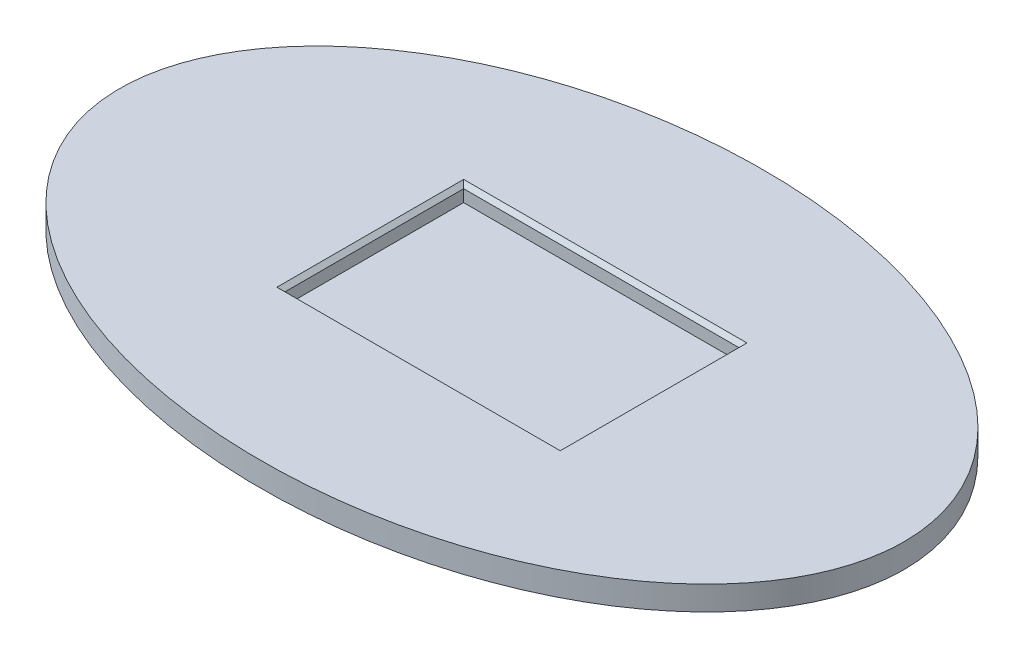
ISO-10303-21;
HEADER;
FILE_DESCRIPTION(('STEP AP214'),'2;1');
FILE_NAME('part.step','',(''),(''),'','','');
FILE_SCHEMA(('AUTOMOTIVE_DESIGN { 1 0 10303 214 1 1 1 1 }'));
ENDSEC;
DATA;
#1=APPLICATION_CONTEXT('core data for automotive mechanical design processes');
#2=APPLICATION_PROTOCOL_DEFINITION('international standard','automotive_design',2000,#1);
#3=PRODUCT_CONTEXT('',#1,'mechanical');
#4=PRODUCT('Part','Part','',(#3));
#5=PRODUCT_RELATED_PRODUCT_CATEGORY('part','',(#4));
#6=PRODUCT_DEFINITION_FORMATION('','',#4);
#7=PRODUCT_DEFINITION_CONTEXT('part definition',#1,'design');
#8=PRODUCT_DEFINITION('design','',#6,#7);
#9=PRODUCT_DEFINITION_SHAPE('','',#8);
#10=(LENGTH_UNIT() NAMED_UNIT(*) SI_UNIT(.MILLI.,.METRE.));
#11=(NAMED_UNIT(*) PLANE_ANGLE_UNIT() SI_UNIT($,.RADIAN.));
#12=(NAMED_UNIT(*) SI_UNIT($,.STERADIAN.) SOLID_ANGLE_UNIT());
#13=UNCERTAINTY_MEASURE_WITH_UNIT(LENGTH_MEASURE(1.E-05),#10,'distance_accuracy_value','');
#14=(GEOMETRIC_REPRESENTATION_CONTEXT(3) GLOBAL_UNCERTAINTY_ASSIGNED_CONTEXT((#13)) GLOBAL_UNIT_ASSIGNED_CONTEXT((#10,
#11,#12)) REPRESENTATION_CONTEXT('',''));
#15=CARTESIAN_POINT('',(0.,0.,0.));
#16=DIRECTION('',(0.,0.,1.));
#17=DIRECTION('',(1.,0.,0.));
#18=AXIS2_PLACEMENT_3D('',#15,#16,#17);
#19=CARTESIAN_POINT('',(0.,3.,0.));
#20=DIRECTION('',(0.,1.,0.));
#21=DIRECTION('',(1.,0.,0.));
#22=AXIS2_PLACEMENT_3D('',#19,#20,#21);
#23=ELLIPSE('',#22,97.5,62.5);
#24=DIRECTION('',(0.,-1.,0.));
#25=VECTOR('',#24,1.);
#26=SURFACE_OF_LINEAR_EXTRUSION('',#23,#25);
#27=CARTESIAN_POINT('',(97.5,3.,0.));
#28=VERTEX_POINT('',#27);
#29=EDGE_CURVE('E140',#28,#28,#23,.T.);
#30=ORIENTED_EDGE('',*,*,#29,.F.);
#31=EDGE_LOOP('',(#30));
#32=FACE_BOUND('',#31,.T.);
#33=CARTESIAN_POINT('',(0.,-3.,0.));
#34=DIRECTION('',(0.,1.,0.));
#35=DIRECTION('',(1.,0.,0.));
#36=AXIS2_PLACEMENT_3D('',#33,#34,#35);
#37=ELLIPSE('',#36,97.5,62.5);
#38=CARTESIAN_POINT('',(97.5,-3.,0.));
#39=VERTEX_POINT('',#38);
#40=EDGE_CURVE('E134',#39,#39,#37,.T.);
#41=ORIENTED_EDGE('',*,*,#40,.T.);
#42=EDGE_LOOP('',(#41));
#43=FACE_BOUND('',#42,.T.);
#44=ADVANCED_FACE('F41',(#32,#43),#26,.F.);
#45=CARTESIAN_POINT('',(0.,3.,0.));
#46=DIRECTION('',(0.,1.,0.));
#47=DIRECTION('',(0.,0.,1.));
#48=AXIS2_PLACEMENT_3D('',#45,#46,#47);
#49=PLANE('',#48);
#50=DIRECTION('',(1.,0.,0.));
#51=VECTOR('',#50,1.);
#52=CARTESIAN_POINT('',(34.2,3.,-23.2));
#53=LINE('',#52,#51);
#54=CARTESIAN_POINT('',(-35.2,3.,-23.2));
#55=VERTEX_POINT('',#54);
#56=CARTESIAN_POINT('',(35.2,3.,-23.2));
#57=VERTEX_POINT('',#56);
#58=EDGE_CURVE('E190',#55,#57,#53,.T.);
#59=ORIENTED_EDGE('',*,*,#58,.T.);
#60=DIRECTION('',(0.,0.,1.));
#61=VECTOR('',#60,1.);
#62=CARTESIAN_POINT('',(35.2,3.,22.2));
#63=LINE('',#62,#61);
#64=CARTESIAN_POINT('',(35.2,3.,23.2));
#65=VERTEX_POINT('',#64);
#66=EDGE_CURVE('E194',#57,#65,#63,.T.);
#67=ORIENTED_EDGE('',*,*,#66,.T.);
#68=DIRECTION('',(-1.,0.,0.));
#69=VECTOR('',#68,1.);
#70=CARTESIAN_POINT('',(-34.2,3.,23.2));
#71=LINE('',#70,#69);
#72=CARTESIAN_POINT('',(-35.2,3.,23.2));
#73=VERTEX_POINT('',#72);
#74=EDGE_CURVE('E181',#65,#73,#71,.T.);
#75=ORIENTED_EDGE('',*,*,#74,.T.);
#76=DIRECTION('',(0.,0.,-1.));
#77=VECTOR('',#76,1.);
#78=CARTESIAN_POINT('',(-35.2,3.,-22.2));
#79=LINE('',#78,#77);
#80=EDGE_CURVE('E186',#73,#55,#79,.T.);
#81=ORIENTED_EDGE('',*,*,#80,.T.);
#82=EDGE_LOOP('',(#59,#67,#75,#81));
#83=FACE_BOUND('',#82,.T.);
#84=ORIENTED_EDGE('',*,*,#29,.T.);
#85=EDGE_LOOP('',(#84));
#86=FACE_BOUND('',#85,.T.);
#87=ADVANCED_FACE('F150',(#83,#86),#49,.T.);
#88=CARTESIAN_POINT('',(0.,-3.,0.));
#89=DIRECTION('',(0.,1.,0.));
#90=DIRECTION('',(0.,0.,1.));
#91=AXIS2_PLACEMENT_3D('',#88,#89,#90);
#92=PLANE('',#91);
#93=ORIENTED_EDGE('',*,*,#40,.F.);
#94=EDGE_LOOP('',(#93));
#95=FACE_BOUND('',#94,.T.);
#96=ADVANCED_FACE('F152',(#95),#92,.F.);
#97=CARTESIAN_POINT('',(34.2,-1.,-22.2));
#98=DIRECTION('',(1.,0.,0.));
#99=DIRECTION('',(0.,0.,-1.));
#100=AXIS2_PLACEMENT_3D('',#97,#98,#99);
#101=PLANE('',#100);
#102=DIRECTION('',(0.,1.,0.));
#103=VECTOR('',#102,1.);
#104=CARTESIAN_POINT('',(34.2,-1.,22.2));
#105=LINE('',#104,#103);
#106=CARTESIAN_POINT('',(34.2,-1.,22.2));
#107=VERTEX_POINT('',#106);
#108=CARTESIAN_POINT('',(34.2,2.00000000000003,22.2));
#109=VERTEX_POINT('',#108);
#110=EDGE_CURVE('E131',#107,#109,#105,.T.);
#111=ORIENTED_EDGE('',*,*,#110,.T.);
#112=DIRECTION('',(0.,0.,-1.));
#113=VECTOR('',#112,1.);
#114=CARTESIAN_POINT('',(34.2,2.00000000000003,-22.2));
#115=LINE('',#114,#113);
#116=CARTESIAN_POINT('',(34.2,2.00000000000003,-22.2));
#117=VERTEX_POINT('',#116);
#118=EDGE_CURVE('E105',#109,#117,#115,.T.);
#119=ORIENTED_EDGE('',*,*,#118,.T.);
#120=DIRECTION('',(0.,1.,0.));
#121=VECTOR('',#120,1.);
#122=CARTESIAN_POINT('',(34.2,-1.,-22.2));
#123=LINE('',#122,#121);
#124=CARTESIAN_POINT('',(34.2,-1.,-22.2));
#125=VERTEX_POINT('',#124);
#126=EDGE_CURVE('E97',#125,#117,#123,.T.);
#127=ORIENTED_EDGE('',*,*,#126,.F.);
#128=DIRECTION('',(0.,0.,-1.));
#129=VECTOR('',#128,1.);
#130=CARTESIAN_POINT('',(34.2,-1.,-22.2));
#131=LINE('',#130,#129);
#132=EDGE_CURVE('E102',#107,#125,#131,.T.);
#133=ORIENTED_EDGE('',*,*,#132,.F.);
#134=EDGE_LOOP('',(#111,#119,#127,#133));
#135=FACE_BOUND('',#134,.T.);
#136=ADVANCED_FACE('F100',(#135),#101,.F.);
#137=CARTESIAN_POINT('',(-34.2,-1.,22.2));
#138=DIRECTION('',(0.,0.,1.));
#139=DIRECTION('',(1.,0.,0.));
#140=AXIS2_PLACEMENT_3D('',#137,#138,#139);
#141=PLANE('',#140);
#142=DIRECTION('',(0.,1.,0.));
#143=VECTOR('',#142,1.);
#144=CARTESIAN_POINT('',(-34.2,-1.,22.2));
#145=LINE('',#144,#143);
#146=CARTESIAN_POINT('',(-34.2,-1.,22.2));
#147=VERTEX_POINT('',#146);
#148=CARTESIAN_POINT('',(-34.2,2.00000000000003,22.2));
#149=VERTEX_POINT('',#148);
#150=EDGE_CURVE('E135',#147,#149,#145,.T.);
#151=ORIENTED_EDGE('',*,*,#150,.T.);
#152=DIRECTION('',(1.,0.,0.));
#153=VECTOR('',#152,1.);
#154=CARTESIAN_POINT('',(34.2,2.00000000000003,22.2));
#155=LINE('',#154,#153);
#156=EDGE_CURVE('E11',#149,#109,#155,.T.);
#157=ORIENTED_EDGE('',*,*,#156,.T.);
#158=ORIENTED_EDGE('',*,*,#110,.F.);
#159=DIRECTION('',(1.,0.,0.));
#160=VECTOR('',#159,1.);
#161=CARTESIAN_POINT('',(-34.2,-1.,22.2));
#162=LINE('',#161,#160);
#163=EDGE_CURVE('E108',#147,#107,#162,.T.);
#164=ORIENTED_EDGE('',*,*,#163,.F.);
#165=EDGE_LOOP('',(#151,#157,#158,#164));
#166=FACE_BOUND('',#165,.T.);
#167=ADVANCED_FACE('F224',(#166),#141,.F.);
#168=CARTESIAN_POINT('',(-34.2,-1.,-22.2));
#169=DIRECTION('',(-1.,0.,0.));
#170=DIRECTION('',(0.,0.,1.));
#171=AXIS2_PLACEMENT_3D('',#168,#169,#170);
#172=PLANE('',#171);
#173=DIRECTION('',(0.,1.,0.));
#174=VECTOR('',#173,1.);
#175=CARTESIAN_POINT('',(-34.2,-1.,-22.2));
#176=LINE('',#175,#174);
#177=CARTESIAN_POINT('',(-34.2,-1.,-22.2));
#178=VERTEX_POINT('',#177);
#179=CARTESIAN_POINT('',(-34.2,2.00000000000003,-22.2));
#180=VERTEX_POINT('',#179);
#181=EDGE_CURVE('E107',#178,#180,#176,.T.);
#182=ORIENTED_EDGE('',*,*,#181,.T.);
#183=DIRECTION('',(0.,0.,1.));
#184=VECTOR('',#183,1.);
#185=CARTESIAN_POINT('',(-34.2,2.00000000000003,22.2));
#186=LINE('',#185,#184);
#187=EDGE_CURVE('E52',#180,#149,#186,.T.);
#188=ORIENTED_EDGE('',*,*,#187,.T.);
#189=ORIENTED_EDGE('',*,*,#150,.F.);
#190=DIRECTION('',(0.,0.,1.));
#191=VECTOR('',#190,1.);
#192=CARTESIAN_POINT('',(-34.2,-1.,-22.2));
#193=LINE('',#192,#191);
#194=EDGE_CURVE('E117',#178,#147,#193,.T.);
#195=ORIENTED_EDGE('',*,*,#194,.F.);
#196=EDGE_LOOP('',(#182,#188,#189,#195));
#197=FACE_BOUND('',#196,.T.);
#198=ADVANCED_FACE('F231',(#197),#172,.F.);
#199=CARTESIAN_POINT('',(-34.2,-1.,-22.2));
#200=DIRECTION('',(0.,0.,-1.));
#201=DIRECTION('',(-1.,0.,0.));
#202=AXIS2_PLACEMENT_3D('',#199,#200,#201);
#203=PLANE('',#202);
#204=ORIENTED_EDGE('',*,*,#126,.T.);
#205=DIRECTION('',(-1.,0.,0.));
#206=VECTOR('',#205,1.);
#207=CARTESIAN_POINT('',(-34.2,2.00000000000003,-22.2));
#208=LINE('',#207,#206);
#209=EDGE_CURVE('E67',#117,#180,#208,.T.);
#210=ORIENTED_EDGE('',*,*,#209,.T.);
#211=ORIENTED_EDGE('',*,*,#181,.F.);
#212=DIRECTION('',(-1.,0.,0.));
#213=VECTOR('',#212,1.);
#214=CARTESIAN_POINT('',(-34.2,-1.,-22.2));
#215=LINE('',#214,#213);
#216=EDGE_CURVE('E111',#125,#178,#215,.T.);
#217=ORIENTED_EDGE('',*,*,#216,.F.);
#218=EDGE_LOOP('',(#204,#210,#211,#217));
#219=FACE_BOUND('',#218,.T.);
#220=ADVANCED_FACE('F112',(#219),#203,.F.);
#221=CARTESIAN_POINT('',(0.,-1.,0.));
#222=DIRECTION('',(0.,1.,0.));
#223=DIRECTION('',(0.,0.,1.));
#224=AXIS2_PLACEMENT_3D('',#221,#222,#223);
#225=PLANE('',#224);
#226=ORIENTED_EDGE('',*,*,#132,.T.);
#227=ORIENTED_EDGE('',*,*,#216,.T.);
#228=ORIENTED_EDGE('',*,*,#194,.T.);
#229=ORIENTED_EDGE('',*,*,#163,.T.);
#230=EDGE_LOOP('',(#226,#227,#228,#229));
#231=FACE_BOUND('',#230,.T.);
#232=ADVANCED_FACE('F119',(#231),#225,.T.);
#233=CARTESIAN_POINT('',(-34.2,2.00000000000003,-22.2));
#234=DIRECTION('',(0.707106781186536,0.707106781186559,0.));
#235=DIRECTION('',(0.,0.,-1.));
#236=AXIS2_PLACEMENT_3D('',#233,#234,#235);
#237=PLANE('',#236);
#238=DIRECTION('',(-0.577350269189633,0.577350269189614,-0.57735026918963));
#239=VECTOR('',#238,1.);
#240=CARTESIAN_POINT('',(-34.2,2.00000000000003,-22.2));
#241=LINE('',#240,#239);
#242=EDGE_CURVE('E125',#55,#180,#241,.F.);
#243=ORIENTED_EDGE('',*,*,#242,.F.);
#244=ORIENTED_EDGE('',*,*,#80,.F.);
#245=DIRECTION('',(-0.577350269189632,0.577350269189615,0.57735026918963));
#246=VECTOR('',#245,1.);
#247=CARTESIAN_POINT('',(-19.3999999999997,-12.7999999999998,7.39999999999976));
#248=LINE('',#247,#246);
#249=EDGE_CURVE('E46',#149,#73,#248,.T.);
#250=ORIENTED_EDGE('',*,*,#249,.F.);
#251=ORIENTED_EDGE('',*,*,#187,.F.);
#252=EDGE_LOOP('',(#243,#244,#250,#251));
#253=FACE_BOUND('',#252,.T.);
#254=ADVANCED_FACE('F44',(#253),#237,.T.);
#255=CARTESIAN_POINT('',(-34.2,2.00000000000003,22.2));
#256=DIRECTION('',(0.,0.707106781186557,-0.707106781186538));
#257=DIRECTION('',(-1.,0.,0.));
#258=AXIS2_PLACEMENT_3D('',#255,#256,#257);
#259=PLANE('',#258);
#260=ORIENTED_EDGE('',*,*,#249,.T.);
#261=ORIENTED_EDGE('',*,*,#74,.F.);
#262=DIRECTION('',(-0.577350269189631,-0.577350269189615,-0.577350269189631));
#263=VECTOR('',#262,1.);
#264=CARTESIAN_POINT('',(19.3999999999997,-12.7999999999998,7.39999999999973));
#265=LINE('',#264,#263);
#266=EDGE_CURVE('E207',#109,#65,#265,.F.);
#267=ORIENTED_EDGE('',*,*,#266,.F.);
#268=ORIENTED_EDGE('',*,*,#156,.F.);
#269=EDGE_LOOP('',(#260,#261,#267,#268));
#270=FACE_BOUND('',#269,.T.);
#271=ADVANCED_FACE('F167',(#270),#259,.T.);
#272=CARTESIAN_POINT('',(-34.2,2.00000000000003,-22.2));
#273=DIRECTION('',(0.,0.707106781186557,0.707106781186538));
#274=DIRECTION('',(1.,0.,0.));
#275=AXIS2_PLACEMENT_3D('',#272,#273,#274);
#276=PLANE('',#275);
#277=ORIENTED_EDGE('',*,*,#242,.T.);
#278=ORIENTED_EDGE('',*,*,#209,.F.);
#279=DIRECTION('',(0.577350269189631,0.577350269189615,-0.577350269189631));
#280=VECTOR('',#279,1.);
#281=CARTESIAN_POINT('',(34.2,2.00000000000003,-22.2));
#282=LINE('',#281,#280);
#283=EDGE_CURVE('E204',#57,#117,#282,.F.);
#284=ORIENTED_EDGE('',*,*,#283,.F.);
#285=ORIENTED_EDGE('',*,*,#58,.F.);
#286=EDGE_LOOP('',(#277,#278,#284,#285));
#287=FACE_BOUND('',#286,.T.);
#288=ADVANCED_FACE('F161',(#287),#276,.T.);
#289=CARTESIAN_POINT('',(34.2,2.00000000000003,-22.2));
#290=DIRECTION('',(-0.707106781186538,0.707106781186557,0.));
#291=DIRECTION('',(0.,0.,1.));
#292=AXIS2_PLACEMENT_3D('',#289,#290,#291);
#293=PLANE('',#292);
#294=ORIENTED_EDGE('',*,*,#266,.T.);
#295=ORIENTED_EDGE('',*,*,#66,.F.);
#296=ORIENTED_EDGE('',*,*,#283,.T.);
#297=ORIENTED_EDGE('',*,*,#118,.F.);
#298=EDGE_LOOP('',(#294,#295,#296,#297));
#299=FACE_BOUND('',#298,.T.);
#300=ADVANCED_FACE('F155',(#299),#293,.T.);
#301=CLOSED_SHELL('',(#44,#87,#96,#136,#167,#198,#220,#232,#254,#271,#288,#300));
#302=MANIFOLD_SOLID_BREP('B2',#301);
#303=ADVANCED_BREP_SHAPE_REPRESENTATION('',(#18,#302),#14);
#304=SHAPE_DEFINITION_REPRESENTATION(#9,#303);
ENDSEC;
END-ISO-10303-21;
